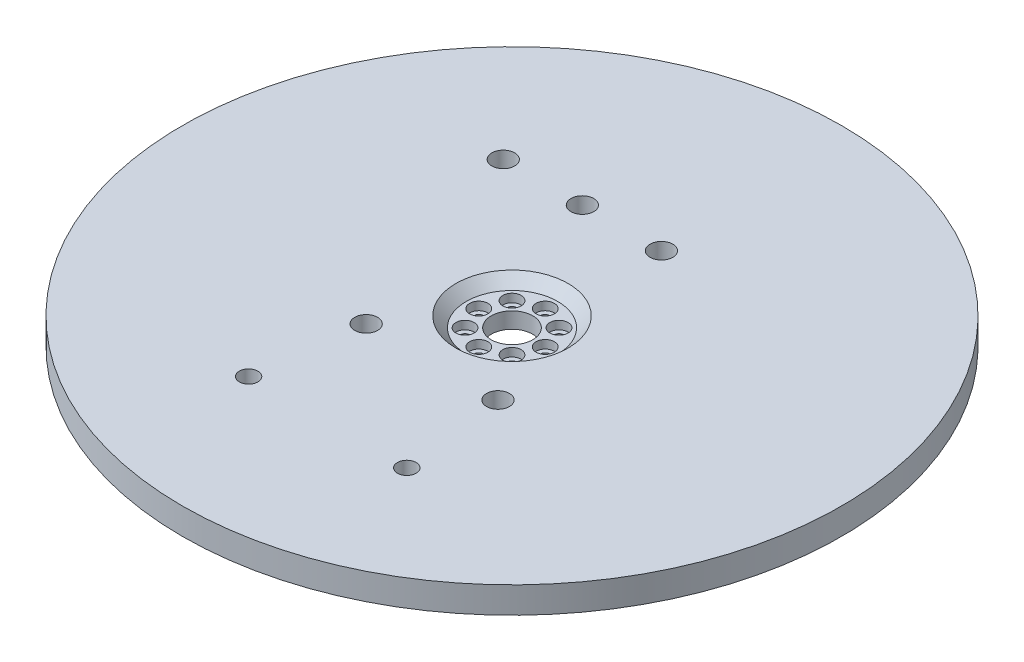
ISO-10303-21;
HEADER;
FILE_DESCRIPTION(('STEP AP214'),'2;1');
FILE_NAME('part.step','',(''),(''),'','','');
FILE_SCHEMA(('AUTOMOTIVE_DESIGN { 1 0 10303 214 1 1 1 1 }'));
ENDSEC;
DATA;
#1=APPLICATION_CONTEXT('core data for automotive mechanical design processes');
#2=APPLICATION_PROTOCOL_DEFINITION('international standard','automotive_design',2000,#1);
#3=PRODUCT_CONTEXT('',#1,'mechanical');
#4=PRODUCT('Part','Part','',(#3));
#5=PRODUCT_RELATED_PRODUCT_CATEGORY('part','',(#4));
#6=PRODUCT_DEFINITION_FORMATION('','',#4);
#7=PRODUCT_DEFINITION_CONTEXT('part definition',#1,'design');
#8=PRODUCT_DEFINITION('design','',#6,#7);
#9=PRODUCT_DEFINITION_SHAPE('','',#8);
#10=(LENGTH_UNIT() NAMED_UNIT(*) SI_UNIT(.MILLI.,.METRE.));
#11=(NAMED_UNIT(*) PLANE_ANGLE_UNIT() SI_UNIT($,.RADIAN.));
#12=(NAMED_UNIT(*) SI_UNIT($,.STERADIAN.) SOLID_ANGLE_UNIT());
#13=UNCERTAINTY_MEASURE_WITH_UNIT(LENGTH_MEASURE(1.E-05),#10,'distance_accuracy_value','');
#14=(GEOMETRIC_REPRESENTATION_CONTEXT(3) GLOBAL_UNCERTAINTY_ASSIGNED_CONTEXT((#13)) GLOBAL_UNIT_ASSIGNED_CONTEXT((#10,
#11,#12)) REPRESENTATION_CONTEXT('',''));
#15=CARTESIAN_POINT('',(0.,0.,0.));
#16=DIRECTION('',(0.,0.,1.));
#17=DIRECTION('',(1.,0.,0.));
#18=AXIS2_PLACEMENT_3D('',#15,#16,#17);
#19=CARTESIAN_POINT('',(0.,3.175,0.));
#20=DIRECTION('',(0.,-1.,0.));
#21=DIRECTION('',(0.,0.,-1.));
#22=AXIS2_PLACEMENT_3D('',#19,#20,#21);
#23=CYLINDRICAL_SURFACE('',#22,79.375);
#24=CARTESIAN_POINT('',(0.,3.175,0.));
#25=DIRECTION('',(0.,1.,0.));
#26=DIRECTION('',(0.,0.,1.));
#27=AXIS2_PLACEMENT_3D('',#24,#25,#26);
#28=CIRCLE('',#27,79.375);
#29=CARTESIAN_POINT('',(0.,3.175,79.375));
#30=VERTEX_POINT('',#29);
#31=EDGE_CURVE('E51',#30,#30,#28,.T.);
#32=ORIENTED_EDGE('',*,*,#31,.F.);
#33=EDGE_LOOP('',(#32));
#34=FACE_BOUND('',#33,.T.);
#35=CARTESIAN_POINT('',(0.,-3.175,0.));
#36=DIRECTION('',(0.,1.,0.));
#37=DIRECTION('',(0.,0.,1.));
#38=AXIS2_PLACEMENT_3D('',#35,#36,#37);
#39=CIRCLE('',#38,79.375);
#40=CARTESIAN_POINT('',(0.,-3.175,79.375));
#41=VERTEX_POINT('',#40);
#42=EDGE_CURVE('E55',#41,#41,#39,.T.);
#43=ORIENTED_EDGE('',*,*,#42,.T.);
#44=EDGE_LOOP('',(#43));
#45=FACE_BOUND('',#44,.T.);
#46=ADVANCED_FACE('F43',(#34,#45),#23,.T.);
#47=CARTESIAN_POINT('',(0.,3.175,0.));
#48=DIRECTION('',(0.,1.,0.));
#49=DIRECTION('',(0.,0.,1.));
#50=AXIS2_PLACEMENT_3D('',#47,#48,#49);
#51=PLANE('',#50);
#52=CARTESIAN_POINT('',(0.,3.175,0.));
#53=DIRECTION('',(0.,1.,0.));
#54=DIRECTION('',(0.,0.,1.));
#55=AXIS2_PLACEMENT_3D('',#52,#53,#54);
#56=CIRCLE('',#55,13.5000000000002);
#57=CARTESIAN_POINT('',(0.,3.175,13.5000000000002));
#58=VERTEX_POINT('',#57);
#59=EDGE_CURVE('E11',#58,#58,#56,.F.);
#60=ORIENTED_EDGE('',*,*,#59,.T.);
#61=EDGE_LOOP('',(#60));
#62=FACE_BOUND('',#61,.T.);
#63=CARTESIAN_POINT('',(-33.6688086,3.175,-31.5673879519193));
#64=DIRECTION('',(0.,1.,0.));
#65=DIRECTION('',(0.,0.,1.));
#66=AXIS2_PLACEMENT_3D('',#63,#64,#65);
#67=CIRCLE('',#66,2.75);
#68=CARTESIAN_POINT('',(-33.6688086,3.175,-28.8173879519193));
#69=VERTEX_POINT('',#68);
#70=EDGE_CURVE('E738',#69,#69,#67,.T.);
#71=ORIENTED_EDGE('',*,*,#70,.F.);
#72=EDGE_LOOP('',(#71));
#73=FACE_BOUND('',#72,.T.);
#74=CARTESIAN_POINT('',(-14.6188085999999,3.175,-31.5673879519193));
#75=DIRECTION('',(0.,1.,0.));
#76=DIRECTION('',(0.,0.,1.));
#77=AXIS2_PLACEMENT_3D('',#74,#75,#76);
#78=CIRCLE('',#77,2.75);
#79=CARTESIAN_POINT('',(-14.6188085999999,3.175,-28.8173879519193));
#80=VERTEX_POINT('',#79);
#81=EDGE_CURVE('E734',#80,#80,#78,.T.);
#82=ORIENTED_EDGE('',*,*,#81,.F.);
#83=EDGE_LOOP('',(#82));
#84=FACE_BOUND('',#83,.T.);
#85=CARTESIAN_POINT('',(4.43119140000003,3.175,-31.5673879519193));
#86=DIRECTION('',(0.,1.,0.));
#87=DIRECTION('',(0.,0.,1.));
#88=AXIS2_PLACEMENT_3D('',#85,#86,#87);
#89=CIRCLE('',#88,2.75);
#90=CARTESIAN_POINT('',(4.43119140000003,3.175,-28.8173879519193));
#91=VERTEX_POINT('',#90);
#92=EDGE_CURVE('E730',#91,#91,#89,.T.);
#93=ORIENTED_EDGE('',*,*,#92,.F.);
#94=EDGE_LOOP('',(#93));
#95=FACE_BOUND('',#94,.T.);
#96=CARTESIAN_POINT('',(-15.875,3.175,19.2497064480811));
#97=DIRECTION('',(0.,1.,0.));
#98=DIRECTION('',(0.,0.,1.));
#99=AXIS2_PLACEMENT_3D('',#96,#97,#98);
#100=CIRCLE('',#99,2.75);
#101=CARTESIAN_POINT('',(-15.875,3.175,21.9997064480811));
#102=VERTEX_POINT('',#101);
#103=EDGE_CURVE('E726',#102,#102,#100,.T.);
#104=ORIENTED_EDGE('',*,*,#103,.F.);
#105=EDGE_LOOP('',(#104));
#106=FACE_BOUND('',#105,.T.);
#107=CARTESIAN_POINT('',(15.875,3.175,19.2497064480811));
#108=DIRECTION('',(0.,1.,0.));
#109=DIRECTION('',(0.,0.,1.));
#110=AXIS2_PLACEMENT_3D('',#107,#108,#109);
#111=CIRCLE('',#110,2.75);
#112=CARTESIAN_POINT('',(15.875,3.175,21.9997064480811));
#113=VERTEX_POINT('',#112);
#114=EDGE_CURVE('E722',#113,#113,#111,.T.);
#115=ORIENTED_EDGE('',*,*,#114,.F.);
#116=EDGE_LOOP('',(#115));
#117=FACE_BOUND('',#116,.T.);
#118=CARTESIAN_POINT('',(19.0500000000001,3.175,44.3882120480811));
#119=DIRECTION('',(0.,1.,0.));
#120=DIRECTION('',(0.,0.,1.));
#121=AXIS2_PLACEMENT_3D('',#118,#119,#120);
#122=CIRCLE('',#121,2.25);
#123=CARTESIAN_POINT('',(19.0500000000001,3.175,46.6382120480811));
#124=VERTEX_POINT('',#123);
#125=EDGE_CURVE('E718',#124,#124,#122,.T.);
#126=ORIENTED_EDGE('',*,*,#125,.F.);
#127=EDGE_LOOP('',(#126));
#128=FACE_BOUND('',#127,.T.);
#129=CARTESIAN_POINT('',(-19.0499999999999,3.175,44.3882120480811));
#130=DIRECTION('',(0.,1.,0.));
#131=DIRECTION('',(0.,0.,1.));
#132=AXIS2_PLACEMENT_3D('',#129,#130,#131);
#133=CIRCLE('',#132,2.25);
#134=CARTESIAN_POINT('',(-19.0499999999999,3.175,46.6382120480811));
#135=VERTEX_POINT('',#134);
#136=EDGE_CURVE('E712',#135,#135,#133,.T.);
#137=ORIENTED_EDGE('',*,*,#136,.F.);
#138=EDGE_LOOP('',(#137));
#139=FACE_BOUND('',#138,.T.);
#140=ORIENTED_EDGE('',*,*,#31,.T.);
#141=EDGE_LOOP('',(#140));
#142=FACE_BOUND('',#141,.T.);
#143=ADVANCED_FACE('F188',(#62,#73,#84,#95,#106,#117,#128,#139,#142),#51,.T.);
#144=CARTESIAN_POINT('',(0.,-3.175,0.));
#145=DIRECTION('',(0.,1.,0.));
#146=DIRECTION('',(0.,0.,1.));
#147=AXIS2_PLACEMENT_3D('',#144,#145,#146);
#148=PLANE('',#147);
#149=CARTESIAN_POINT('',(-33.6688086,-3.175,-31.5673879519193));
#150=DIRECTION('',(0.,1.,0.));
#151=DIRECTION('',(0.,0.,1.));
#152=AXIS2_PLACEMENT_3D('',#149,#150,#151);
#153=CIRCLE('',#152,2.75);
#154=CARTESIAN_POINT('',(-33.6688086,-3.175,-28.8173879519193));
#155=VERTEX_POINT('',#154);
#156=EDGE_CURVE('E203',#155,#155,#153,.T.);
#157=ORIENTED_EDGE('',*,*,#156,.T.);
#158=EDGE_LOOP('',(#157));
#159=FACE_BOUND('',#158,.T.);
#160=CARTESIAN_POINT('',(-14.6188085999999,-3.175,-31.5673879519193));
#161=DIRECTION('',(0.,1.,0.));
#162=DIRECTION('',(0.,0.,1.));
#163=AXIS2_PLACEMENT_3D('',#160,#161,#162);
#164=CIRCLE('',#163,2.75);
#165=CARTESIAN_POINT('',(-14.6188085999999,-3.175,-28.8173879519193));
#166=VERTEX_POINT('',#165);
#167=EDGE_CURVE('E207',#166,#166,#164,.T.);
#168=ORIENTED_EDGE('',*,*,#167,.T.);
#169=EDGE_LOOP('',(#168));
#170=FACE_BOUND('',#169,.T.);
#171=CARTESIAN_POINT('',(4.43119140000003,-3.175,-31.5673879519193));
#172=DIRECTION('',(0.,1.,0.));
#173=DIRECTION('',(0.,0.,1.));
#174=AXIS2_PLACEMENT_3D('',#171,#172,#173);
#175=CIRCLE('',#174,2.75);
#176=CARTESIAN_POINT('',(4.43119140000003,-3.175,-28.8173879519193));
#177=VERTEX_POINT('',#176);
#178=EDGE_CURVE('E211',#177,#177,#175,.T.);
#179=ORIENTED_EDGE('',*,*,#178,.T.);
#180=EDGE_LOOP('',(#179));
#181=FACE_BOUND('',#180,.T.);
#182=CARTESIAN_POINT('',(-15.875,-3.175,19.2497064480811));
#183=DIRECTION('',(0.,1.,0.));
#184=DIRECTION('',(0.,0.,1.));
#185=AXIS2_PLACEMENT_3D('',#182,#183,#184);
#186=CIRCLE('',#185,2.75);
#187=CARTESIAN_POINT('',(-15.875,-3.175,21.9997064480811));
#188=VERTEX_POINT('',#187);
#189=EDGE_CURVE('E215',#188,#188,#186,.T.);
#190=ORIENTED_EDGE('',*,*,#189,.T.);
#191=EDGE_LOOP('',(#190));
#192=FACE_BOUND('',#191,.T.);
#193=CARTESIAN_POINT('',(15.875,-3.175,19.2497064480811));
#194=DIRECTION('',(0.,1.,0.));
#195=DIRECTION('',(0.,0.,1.));
#196=AXIS2_PLACEMENT_3D('',#193,#194,#195);
#197=CIRCLE('',#196,2.75);
#198=CARTESIAN_POINT('',(15.875,-3.175,21.9997064480811));
#199=VERTEX_POINT('',#198);
#200=EDGE_CURVE('E219',#199,#199,#197,.T.);
#201=ORIENTED_EDGE('',*,*,#200,.T.);
#202=EDGE_LOOP('',(#201));
#203=FACE_BOUND('',#202,.T.);
#204=CARTESIAN_POINT('',(19.0500000000001,-3.175,44.3882120480811));
#205=DIRECTION('',(0.,1.,0.));
#206=DIRECTION('',(0.,0.,1.));
#207=AXIS2_PLACEMENT_3D('',#204,#205,#206);
#208=CIRCLE('',#207,2.25);
#209=CARTESIAN_POINT('',(19.0500000000001,-3.175,46.6382120480811));
#210=VERTEX_POINT('',#209);
#211=EDGE_CURVE('E223',#210,#210,#208,.T.);
#212=ORIENTED_EDGE('',*,*,#211,.T.);
#213=EDGE_LOOP('',(#212));
#214=FACE_BOUND('',#213,.T.);
#215=CARTESIAN_POINT('',(-19.0499999999999,-3.175,44.3882120480811));
#216=DIRECTION('',(0.,1.,0.));
#217=DIRECTION('',(0.,0.,1.));
#218=AXIS2_PLACEMENT_3D('',#215,#216,#217);
#219=CIRCLE('',#218,2.25);
#220=CARTESIAN_POINT('',(-19.0499999999999,-3.175,46.6382120480811));
#221=VERTEX_POINT('',#220);
#222=EDGE_CURVE('E226',#221,#221,#219,.T.);
#223=ORIENTED_EDGE('',*,*,#222,.T.);
#224=EDGE_LOOP('',(#223));
#225=FACE_BOUND('',#224,.T.);
#226=CARTESIAN_POINT('',(-5.6568542495,-3.175,-5.6568542495));
#227=DIRECTION('',(0.,1.,0.));
#228=DIRECTION('',(0.,0.,1.));
#229=AXIS2_PLACEMENT_3D('',#226,#227,#228);
#230=CIRCLE('',#229,1.1);
#231=CARTESIAN_POINT('',(-5.6568542495,-3.175,-4.5568542495));
#232=VERTEX_POINT('',#231);
#233=EDGE_CURVE('E102',#232,#232,#230,.T.);
#234=ORIENTED_EDGE('',*,*,#233,.T.);
#235=EDGE_LOOP('',(#234));
#236=FACE_BOUND('',#235,.T.);
#237=CARTESIAN_POINT('',(0.,-3.175,-8.));
#238=DIRECTION('',(0.,1.,0.));
#239=DIRECTION('',(0.,0.,1.));
#240=AXIS2_PLACEMENT_3D('',#237,#238,#239);
#241=CIRCLE('',#240,1.1);
#242=CARTESIAN_POINT('',(0.,-3.175,-6.9));
#243=VERTEX_POINT('',#242);
#244=EDGE_CURVE('E98',#243,#243,#241,.T.);
#245=ORIENTED_EDGE('',*,*,#244,.T.);
#246=EDGE_LOOP('',(#245));
#247=FACE_BOUND('',#246,.T.);
#248=CARTESIAN_POINT('',(5.6568542495,-3.175,-5.6568542495));
#249=DIRECTION('',(0.,1.,0.));
#250=DIRECTION('',(0.,0.,1.));
#251=AXIS2_PLACEMENT_3D('',#248,#249,#250);
#252=CIRCLE('',#251,1.1);
#253=CARTESIAN_POINT('',(5.6568542495,-3.175,-4.5568542495));
#254=VERTEX_POINT('',#253);
#255=EDGE_CURVE('E93',#254,#254,#252,.T.);
#256=ORIENTED_EDGE('',*,*,#255,.T.);
#257=EDGE_LOOP('',(#256));
#258=FACE_BOUND('',#257,.T.);
#259=CARTESIAN_POINT('',(8.,-3.175,0.));
#260=DIRECTION('',(0.,1.,0.));
#261=DIRECTION('',(0.,0.,1.));
#262=AXIS2_PLACEMENT_3D('',#259,#260,#261);
#263=CIRCLE('',#262,1.1);
#264=CARTESIAN_POINT('',(8.,-3.175,1.1));
#265=VERTEX_POINT('',#264);
#266=EDGE_CURVE('E88',#265,#265,#263,.T.);
#267=ORIENTED_EDGE('',*,*,#266,.T.);
#268=EDGE_LOOP('',(#267));
#269=FACE_BOUND('',#268,.T.);
#270=CARTESIAN_POINT('',(5.6568542495,-3.175,5.6568542495));
#271=DIRECTION('',(0.,1.,0.));
#272=DIRECTION('',(0.,0.,1.));
#273=AXIS2_PLACEMENT_3D('',#270,#271,#272);
#274=CIRCLE('',#273,1.1);
#275=CARTESIAN_POINT('',(5.6568542495,-3.175,6.7568542495));
#276=VERTEX_POINT('',#275);
#277=EDGE_CURVE('E83',#276,#276,#274,.T.);
#278=ORIENTED_EDGE('',*,*,#277,.T.);
#279=EDGE_LOOP('',(#278));
#280=FACE_BOUND('',#279,.T.);
#281=CARTESIAN_POINT('',(0.,-3.175,8.));
#282=DIRECTION('',(0.,1.,0.));
#283=DIRECTION('',(0.,0.,1.));
#284=AXIS2_PLACEMENT_3D('',#281,#282,#283);
#285=CIRCLE('',#284,1.1);
#286=CARTESIAN_POINT('',(0.,-3.175,9.1));
#287=VERTEX_POINT('',#286);
#288=EDGE_CURVE('E78',#287,#287,#285,.T.);
#289=ORIENTED_EDGE('',*,*,#288,.T.);
#290=EDGE_LOOP('',(#289));
#291=FACE_BOUND('',#290,.T.);
#292=CARTESIAN_POINT('',(-5.6568542495,-3.175,5.6568542495));
#293=DIRECTION('',(0.,1.,0.));
#294=DIRECTION('',(0.,0.,1.));
#295=AXIS2_PLACEMENT_3D('',#292,#293,#294);
#296=CIRCLE('',#295,1.1);
#297=CARTESIAN_POINT('',(-5.6568542495,-3.175,6.7568542495));
#298=VERTEX_POINT('',#297);
#299=EDGE_CURVE('E73',#298,#298,#296,.T.);
#300=ORIENTED_EDGE('',*,*,#299,.T.);
#301=EDGE_LOOP('',(#300));
#302=FACE_BOUND('',#301,.T.);
#303=CARTESIAN_POINT('',(-8.,-3.175,0.));
#304=DIRECTION('',(0.,1.,0.));
#305=DIRECTION('',(0.,0.,1.));
#306=AXIS2_PLACEMENT_3D('',#303,#304,#305);
#307=CIRCLE('',#306,1.1);
#308=CARTESIAN_POINT('',(-8.,-3.175,1.1));
#309=VERTEX_POINT('',#308);
#310=EDGE_CURVE('E69',#309,#309,#307,.T.);
#311=ORIENTED_EDGE('',*,*,#310,.T.);
#312=EDGE_LOOP('',(#311));
#313=FACE_BOUND('',#312,.T.);
#314=CARTESIAN_POINT('',(0.,-3.175,0.));
#315=DIRECTION('',(0.,1.,0.));
#316=DIRECTION('',(0.,0.,1.));
#317=AXIS2_PLACEMENT_3D('',#314,#315,#316);
#318=CIRCLE('',#317,5.);
#319=CARTESIAN_POINT('',(0.,-3.175,5.));
#320=VERTEX_POINT('',#319);
#321=EDGE_CURVE('E68',#320,#320,#318,.T.);
#322=ORIENTED_EDGE('',*,*,#321,.T.);
#323=EDGE_LOOP('',(#322));
#324=FACE_BOUND('',#323,.T.);
#325=ORIENTED_EDGE('',*,*,#42,.F.);
#326=EDGE_LOOP('',(#325));
#327=FACE_BOUND('',#326,.T.);
#328=ADVANCED_FACE('F169',(#159,#170,#181,#192,#203,#214,#225,#236,#247,#258,#269,#280,#291,
#302,#313,#324,#327),#148,.F.);
#329=CARTESIAN_POINT('',(0.,0.675,0.));
#330=DIRECTION('',(0.,1.,0.));
#331=DIRECTION('',(0.,0.,1.));
#332=AXIS2_PLACEMENT_3D('',#329,#330,#331);
#333=PLANE('',#332);
#334=CARTESIAN_POINT('',(-5.6568542495,0.675,-5.6568542495));
#335=DIRECTION('',(0.,1.,0.));
#336=DIRECTION('',(0.,0.,1.));
#337=AXIS2_PLACEMENT_3D('',#334,#335,#336);
#338=CIRCLE('',#337,2.19999999999999);
#339=CARTESIAN_POINT('',(-5.6568542495,0.675,-3.45685424950001));
#340=VERTEX_POINT('',#339);
#341=EDGE_CURVE('E117',#340,#340,#338,.T.);
#342=ORIENTED_EDGE('',*,*,#341,.F.);
#343=EDGE_LOOP('',(#342));
#344=FACE_BOUND('',#343,.T.);
#345=CARTESIAN_POINT('',(0.,0.675,-8.));
#346=DIRECTION('',(0.,1.,0.));
#347=DIRECTION('',(0.,0.,1.));
#348=AXIS2_PLACEMENT_3D('',#345,#346,#347);
#349=CIRCLE('',#348,2.19999999999999);
#350=CARTESIAN_POINT('',(0.,0.675,-5.80000000000001));
#351=VERTEX_POINT('',#350);
#352=EDGE_CURVE('E104',#351,#351,#349,.T.);
#353=ORIENTED_EDGE('',*,*,#352,.F.);
#354=EDGE_LOOP('',(#353));
#355=FACE_BOUND('',#354,.T.);
#356=CARTESIAN_POINT('',(5.6568542495,0.675,-5.6568542495));
#357=DIRECTION('',(0.,1.,0.));
#358=DIRECTION('',(0.,0.,1.));
#359=AXIS2_PLACEMENT_3D('',#356,#357,#358);
#360=CIRCLE('',#359,2.19999999999999);
#361=CARTESIAN_POINT('',(5.6568542495,0.675,-3.45685424950001));
#362=VERTEX_POINT('',#361);
#363=EDGE_CURVE('E100',#362,#362,#360,.T.);
#364=ORIENTED_EDGE('',*,*,#363,.F.);
#365=EDGE_LOOP('',(#364));
#366=FACE_BOUND('',#365,.T.);
#367=CARTESIAN_POINT('',(8.,0.675,0.));
#368=DIRECTION('',(0.,1.,0.));
#369=DIRECTION('',(0.,0.,1.));
#370=AXIS2_PLACEMENT_3D('',#367,#368,#369);
#371=CIRCLE('',#370,2.19999999999999);
#372=CARTESIAN_POINT('',(8.,0.675,2.19999999999999));
#373=VERTEX_POINT('',#372);
#374=EDGE_CURVE('E96',#373,#373,#371,.T.);
#375=ORIENTED_EDGE('',*,*,#374,.F.);
#376=EDGE_LOOP('',(#375));
#377=FACE_BOUND('',#376,.T.);
#378=CARTESIAN_POINT('',(5.6568542495,0.675,5.6568542495));
#379=DIRECTION('',(0.,1.,0.));
#380=DIRECTION('',(0.,0.,1.));
#381=AXIS2_PLACEMENT_3D('',#378,#379,#380);
#382=CIRCLE('',#381,2.19999999999999);
#383=CARTESIAN_POINT('',(5.6568542495,0.675,7.85685424949999));
#384=VERTEX_POINT('',#383);
#385=EDGE_CURVE('E91',#384,#384,#382,.T.);
#386=ORIENTED_EDGE('',*,*,#385,.F.);
#387=EDGE_LOOP('',(#386));
#388=FACE_BOUND('',#387,.T.);
#389=CARTESIAN_POINT('',(0.,0.675,8.));
#390=DIRECTION('',(0.,1.,0.));
#391=DIRECTION('',(0.,0.,1.));
#392=AXIS2_PLACEMENT_3D('',#389,#390,#391);
#393=CIRCLE('',#392,2.19999999999999);
#394=CARTESIAN_POINT('',(0.,0.675,10.2));
#395=VERTEX_POINT('',#394);
#396=EDGE_CURVE('E86',#395,#395,#393,.T.);
#397=ORIENTED_EDGE('',*,*,#396,.F.);
#398=EDGE_LOOP('',(#397));
#399=FACE_BOUND('',#398,.T.);
#400=CARTESIAN_POINT('',(-5.6568542495,0.675,5.6568542495));
#401=DIRECTION('',(0.,1.,0.));
#402=DIRECTION('',(0.,0.,1.));
#403=AXIS2_PLACEMENT_3D('',#400,#401,#402);
#404=CIRCLE('',#403,2.19999999999999);
#405=CARTESIAN_POINT('',(-5.6568542495,0.675,7.85685424949999));
#406=VERTEX_POINT('',#405);
#407=EDGE_CURVE('E81',#406,#406,#404,.T.);
#408=ORIENTED_EDGE('',*,*,#407,.F.);
#409=EDGE_LOOP('',(#408));
#410=FACE_BOUND('',#409,.T.);
#411=CARTESIAN_POINT('',(-8.,0.675,0.));
#412=DIRECTION('',(0.,1.,0.));
#413=DIRECTION('',(0.,0.,1.));
#414=AXIS2_PLACEMENT_3D('',#411,#412,#413);
#415=CIRCLE('',#414,2.19999999999999);
#416=CARTESIAN_POINT('',(-8.,0.675,2.19999999999999));
#417=VERTEX_POINT('',#416);
#418=EDGE_CURVE('E76',#417,#417,#415,.T.);
#419=ORIENTED_EDGE('',*,*,#418,.F.);
#420=EDGE_LOOP('',(#419));
#421=FACE_BOUND('',#420,.T.);
#422=CARTESIAN_POINT('',(0.,0.675,0.));
#423=DIRECTION('',(0.,1.,0.));
#424=DIRECTION('',(0.,0.,1.));
#425=AXIS2_PLACEMENT_3D('',#422,#423,#424);
#426=CIRCLE('',#425,5.);
#427=CARTESIAN_POINT('',(0.,0.675,5.));
#428=VERTEX_POINT('',#427);
#429=EDGE_CURVE('E65',#428,#428,#426,.T.);
#430=ORIENTED_EDGE('',*,*,#429,.F.);
#431=EDGE_LOOP('',(#430));
#432=FACE_BOUND('',#431,.T.);
#433=CARTESIAN_POINT('',(0.,0.675000000000002,0.));
#434=DIRECTION('',(0.,1.,0.));
#435=DIRECTION('',(0.,0.,1.));
#436=AXIS2_PLACEMENT_3D('',#433,#434,#435);
#437=CIRCLE('',#436,11.);
#438=CARTESIAN_POINT('',(0.,0.675000000000002,11.));
#439=VERTEX_POINT('',#438);
#440=EDGE_CURVE('E60',#439,#439,#437,.F.);
#441=ORIENTED_EDGE('',*,*,#440,.F.);
#442=EDGE_LOOP('',(#441));
#443=FACE_BOUND('',#442,.T.);
#444=ADVANCED_FACE('F175',(#344,#355,#366,#377,#388,#399,#410,#421,#432,#443),#333,.T.);
#445=CARTESIAN_POINT('',(0.,-3.175,0.));
#446=DIRECTION('',(0.,1.,0.));
#447=DIRECTION('',(0.,0.,1.));
#448=AXIS2_PLACEMENT_3D('',#445,#446,#447);
#449=CYLINDRICAL_SURFACE('',#448,5.);
#450=ORIENTED_EDGE('',*,*,#429,.T.);
#451=EDGE_LOOP('',(#450));
#452=FACE_BOUND('',#451,.T.);
#453=ORIENTED_EDGE('',*,*,#321,.F.);
#454=EDGE_LOOP('',(#453));
#455=FACE_BOUND('',#454,.T.);
#456=ADVANCED_FACE('F172',(#452,#455),#449,.F.);
#457=CARTESIAN_POINT('',(-8.,0.675,0.));
#458=DIRECTION('',(0.,1.,0.));
#459=DIRECTION('',(0.,0.,1.));
#460=AXIS2_PLACEMENT_3D('',#457,#458,#459);
#461=CYLINDRICAL_SURFACE('',#460,1.1);
#462=CARTESIAN_POINT('',(-8.,-1.325,0.));
#463=DIRECTION('',(0.,1.,0.));
#464=DIRECTION('',(0.,0.,1.));
#465=AXIS2_PLACEMENT_3D('',#462,#463,#464);
#466=CIRCLE('',#465,1.1);
#467=CARTESIAN_POINT('',(-8.,-1.325,1.1));
#468=VERTEX_POINT('',#467);
#469=EDGE_CURVE('E72',#468,#468,#466,.T.);
#470=ORIENTED_EDGE('',*,*,#469,.T.);
#471=EDGE_LOOP('',(#470));
#472=FACE_BOUND('',#471,.T.);
#473=ORIENTED_EDGE('',*,*,#310,.F.);
#474=EDGE_LOOP('',(#473));
#475=FACE_BOUND('',#474,.T.);
#476=ADVANCED_FACE('F174',(#472,#475),#461,.F.);
#477=CARTESIAN_POINT('',(-6.9,-1.325,0.));
#478=DIRECTION('',(0.,-1.,0.));
#479=DIRECTION('',(0.,0.,-1.));
#480=AXIS2_PLACEMENT_3D('',#477,#478,#479);
#481=PLANE('',#480);
#482=ORIENTED_EDGE('',*,*,#469,.F.);
#483=EDGE_LOOP('',(#482));
#484=FACE_BOUND('',#483,.T.);
#485=CARTESIAN_POINT('',(-8.,-1.325,0.));
#486=DIRECTION('',(0.,1.,0.));
#487=DIRECTION('',(0.,0.,1.));
#488=AXIS2_PLACEMENT_3D('',#485,#486,#487);
#489=CIRCLE('',#488,2.2);
#490=CARTESIAN_POINT('',(-8.,-1.325,2.2));
#491=VERTEX_POINT('',#490);
#492=EDGE_CURVE('E162',#491,#491,#489,.T.);
#493=ORIENTED_EDGE('',*,*,#492,.T.);
#494=EDGE_LOOP('',(#493));
#495=FACE_BOUND('',#494,.T.);
#496=ADVANCED_FACE('F182',(#484,#495),#481,.F.);
#497=CARTESIAN_POINT('',(-8.,0.675,0.));
#498=DIRECTION('',(0.,1.,0.));
#499=DIRECTION('',(0.,0.,1.));
#500=AXIS2_PLACEMENT_3D('',#497,#498,#499);
#501=CYLINDRICAL_SURFACE('',#500,2.19999999999999);
#502=ORIENTED_EDGE('',*,*,#492,.F.);
#503=EDGE_LOOP('',(#502));
#504=FACE_BOUND('',#503,.T.);
#505=ORIENTED_EDGE('',*,*,#418,.T.);
#506=EDGE_LOOP('',(#505));
#507=FACE_BOUND('',#506,.T.);
#508=ADVANCED_FACE('F246',(#504,#507),#501,.F.);
#509=CARTESIAN_POINT('',(-5.6568542495,0.675,5.6568542495));
#510=DIRECTION('',(0.,1.,0.));
#511=DIRECTION('',(0.,0.,1.));
#512=AXIS2_PLACEMENT_3D('',#509,#510,#511);
#513=CYLINDRICAL_SURFACE('',#512,1.1);
#514=CARTESIAN_POINT('',(-5.6568542495,-1.325,5.6568542495));
#515=DIRECTION('',(0.,1.,0.));
#516=DIRECTION('',(0.,0.,1.));
#517=AXIS2_PLACEMENT_3D('',#514,#515,#516);
#518=CIRCLE('',#517,1.1);
#519=CARTESIAN_POINT('',(-5.6568542495,-1.325,6.7568542495));
#520=VERTEX_POINT('',#519);
#521=EDGE_CURVE('E77',#520,#520,#518,.T.);
#522=ORIENTED_EDGE('',*,*,#521,.T.);
#523=EDGE_LOOP('',(#522));
#524=FACE_BOUND('',#523,.T.);
#525=ORIENTED_EDGE('',*,*,#299,.F.);
#526=EDGE_LOOP('',(#525));
#527=FACE_BOUND('',#526,.T.);
#528=ADVANCED_FACE('F243',(#524,#527),#513,.F.);
#529=CARTESIAN_POINT('',(-4.5568542495,-1.325,5.6568542495));
#530=DIRECTION('',(0.,-1.,0.));
#531=DIRECTION('',(0.,0.,-1.));
#532=AXIS2_PLACEMENT_3D('',#529,#530,#531);
#533=PLANE('',#532);
#534=ORIENTED_EDGE('',*,*,#521,.F.);
#535=EDGE_LOOP('',(#534));
#536=FACE_BOUND('',#535,.T.);
#537=CARTESIAN_POINT('',(-5.6568542495,-1.325,5.6568542495));
#538=DIRECTION('',(0.,1.,0.));
#539=DIRECTION('',(0.,0.,1.));
#540=AXIS2_PLACEMENT_3D('',#537,#538,#539);
#541=CIRCLE('',#540,2.2);
#542=CARTESIAN_POINT('',(-5.6568542495,-1.325,7.8568542495));
#543=VERTEX_POINT('',#542);
#544=EDGE_CURVE('E155',#543,#543,#541,.T.);
#545=ORIENTED_EDGE('',*,*,#544,.T.);
#546=EDGE_LOOP('',(#545));
#547=FACE_BOUND('',#546,.T.);
#548=ADVANCED_FACE('F245',(#536,#547),#533,.F.);
#549=CARTESIAN_POINT('',(-5.6568542495,0.675,5.6568542495));
#550=DIRECTION('',(0.,1.,0.));
#551=DIRECTION('',(0.,0.,1.));
#552=AXIS2_PLACEMENT_3D('',#549,#550,#551);
#553=CYLINDRICAL_SURFACE('',#552,2.19999999999999);
#554=ORIENTED_EDGE('',*,*,#544,.F.);
#555=EDGE_LOOP('',(#554));
#556=FACE_BOUND('',#555,.T.);
#557=ORIENTED_EDGE('',*,*,#407,.T.);
#558=EDGE_LOOP('',(#557));
#559=FACE_BOUND('',#558,.T.);
#560=ADVANCED_FACE('F253',(#556,#559),#553,.F.);
#561=CARTESIAN_POINT('',(0.,0.675,8.));
#562=DIRECTION('',(0.,1.,0.));
#563=DIRECTION('',(0.,0.,1.));
#564=AXIS2_PLACEMENT_3D('',#561,#562,#563);
#565=CYLINDRICAL_SURFACE('',#564,1.1);
#566=CARTESIAN_POINT('',(0.,-1.325,8.));
#567=DIRECTION('',(0.,1.,0.));
#568=DIRECTION('',(0.,0.,1.));
#569=AXIS2_PLACEMENT_3D('',#566,#567,#568);
#570=CIRCLE('',#569,1.1);
#571=CARTESIAN_POINT('',(0.,-1.325,9.1));
#572=VERTEX_POINT('',#571);
#573=EDGE_CURVE('E82',#572,#572,#570,.T.);
#574=ORIENTED_EDGE('',*,*,#573,.T.);
#575=EDGE_LOOP('',(#574));
#576=FACE_BOUND('',#575,.T.);
#577=ORIENTED_EDGE('',*,*,#288,.F.);
#578=EDGE_LOOP('',(#577));
#579=FACE_BOUND('',#578,.T.);
#580=ADVANCED_FACE('F378',(#576,#579),#565,.F.);
#581=CARTESIAN_POINT('',(1.1,-1.325,8.));
#582=DIRECTION('',(0.,-1.,0.));
#583=DIRECTION('',(0.,0.,-1.));
#584=AXIS2_PLACEMENT_3D('',#581,#582,#583);
#585=PLANE('',#584);
#586=ORIENTED_EDGE('',*,*,#573,.F.);
#587=EDGE_LOOP('',(#586));
#588=FACE_BOUND('',#587,.T.);
#589=CARTESIAN_POINT('',(0.,-1.325,8.));
#590=DIRECTION('',(0.,1.,0.));
#591=DIRECTION('',(0.,0.,1.));
#592=AXIS2_PLACEMENT_3D('',#589,#590,#591);
#593=CIRCLE('',#592,2.2);
#594=CARTESIAN_POINT('',(0.,-1.325,10.2));
#595=VERTEX_POINT('',#594);
#596=EDGE_CURVE('E148',#595,#595,#593,.T.);
#597=ORIENTED_EDGE('',*,*,#596,.T.);
#598=EDGE_LOOP('',(#597));
#599=FACE_BOUND('',#598,.T.);
#600=ADVANCED_FACE('F374',(#588,#599),#585,.F.);
#601=CARTESIAN_POINT('',(0.,0.675,8.));
#602=DIRECTION('',(0.,1.,0.));
#603=DIRECTION('',(0.,0.,1.));
#604=AXIS2_PLACEMENT_3D('',#601,#602,#603);
#605=CYLINDRICAL_SURFACE('',#604,2.19999999999999);
#606=ORIENTED_EDGE('',*,*,#596,.F.);
#607=EDGE_LOOP('',(#606));
#608=FACE_BOUND('',#607,.T.);
#609=ORIENTED_EDGE('',*,*,#396,.T.);
#610=EDGE_LOOP('',(#609));
#611=FACE_BOUND('',#610,.T.);
#612=ADVANCED_FACE('F370',(#608,#611),#605,.F.);
#613=CARTESIAN_POINT('',(5.6568542495,0.675,5.6568542495));
#614=DIRECTION('',(0.,1.,0.));
#615=DIRECTION('',(0.,0.,1.));
#616=AXIS2_PLACEMENT_3D('',#613,#614,#615);
#617=CYLINDRICAL_SURFACE('',#616,1.1);
#618=CARTESIAN_POINT('',(5.6568542495,-1.325,5.6568542495));
#619=DIRECTION('',(0.,1.,0.));
#620=DIRECTION('',(0.,0.,1.));
#621=AXIS2_PLACEMENT_3D('',#618,#619,#620);
#622=CIRCLE('',#621,1.1);
#623=CARTESIAN_POINT('',(5.6568542495,-1.325,6.7568542495));
#624=VERTEX_POINT('',#623);
#625=EDGE_CURVE('E87',#624,#624,#622,.T.);
#626=ORIENTED_EDGE('',*,*,#625,.T.);
#627=EDGE_LOOP('',(#626));
#628=FACE_BOUND('',#627,.T.);
#629=ORIENTED_EDGE('',*,*,#277,.F.);
#630=EDGE_LOOP('',(#629));
#631=FACE_BOUND('',#630,.T.);
#632=ADVANCED_FACE('F366',(#628,#631),#617,.F.);
#633=CARTESIAN_POINT('',(6.7568542495,-1.325,5.6568542495));
#634=DIRECTION('',(0.,-1.,0.));
#635=DIRECTION('',(0.,0.,-1.));
#636=AXIS2_PLACEMENT_3D('',#633,#634,#635);
#637=PLANE('',#636);
#638=ORIENTED_EDGE('',*,*,#625,.F.);
#639=EDGE_LOOP('',(#638));
#640=FACE_BOUND('',#639,.T.);
#641=CARTESIAN_POINT('',(5.6568542495,-1.325,5.6568542495));
#642=DIRECTION('',(0.,1.,0.));
#643=DIRECTION('',(0.,0.,1.));
#644=AXIS2_PLACEMENT_3D('',#641,#642,#643);
#645=CIRCLE('',#644,2.2);
#646=CARTESIAN_POINT('',(5.6568542495,-1.325,7.8568542495));
#647=VERTEX_POINT('',#646);
#648=EDGE_CURVE('E141',#647,#647,#645,.T.);
#649=ORIENTED_EDGE('',*,*,#648,.T.);
#650=EDGE_LOOP('',(#649));
#651=FACE_BOUND('',#650,.T.);
#652=ADVANCED_FACE('F362',(#640,#651),#637,.F.);
#653=CARTESIAN_POINT('',(5.6568542495,0.675,5.6568542495));
#654=DIRECTION('',(0.,1.,0.));
#655=DIRECTION('',(0.,0.,1.));
#656=AXIS2_PLACEMENT_3D('',#653,#654,#655);
#657=CYLINDRICAL_SURFACE('',#656,2.19999999999999);
#658=ORIENTED_EDGE('',*,*,#648,.F.);
#659=EDGE_LOOP('',(#658));
#660=FACE_BOUND('',#659,.T.);
#661=ORIENTED_EDGE('',*,*,#385,.T.);
#662=EDGE_LOOP('',(#661));
#663=FACE_BOUND('',#662,.T.);
#664=ADVANCED_FACE('F358',(#660,#663),#657,.F.);
#665=CARTESIAN_POINT('',(8.,0.675,0.));
#666=DIRECTION('',(0.,1.,0.));
#667=DIRECTION('',(0.,0.,1.));
#668=AXIS2_PLACEMENT_3D('',#665,#666,#667);
#669=CYLINDRICAL_SURFACE('',#668,1.1);
#670=CARTESIAN_POINT('',(8.,-1.325,0.));
#671=DIRECTION('',(0.,1.,0.));
#672=DIRECTION('',(0.,0.,1.));
#673=AXIS2_PLACEMENT_3D('',#670,#671,#672);
#674=CIRCLE('',#673,1.1);
#675=CARTESIAN_POINT('',(8.,-1.325,1.1));
#676=VERTEX_POINT('',#675);
#677=EDGE_CURVE('E92',#676,#676,#674,.T.);
#678=ORIENTED_EDGE('',*,*,#677,.T.);
#679=EDGE_LOOP('',(#678));
#680=FACE_BOUND('',#679,.T.);
#681=ORIENTED_EDGE('',*,*,#266,.F.);
#682=EDGE_LOOP('',(#681));
#683=FACE_BOUND('',#682,.T.);
#684=ADVANCED_FACE('F354',(#680,#683),#669,.F.);
#685=CARTESIAN_POINT('',(9.1,-1.325,0.));
#686=DIRECTION('',(0.,-1.,0.));
#687=DIRECTION('',(0.,0.,-1.));
#688=AXIS2_PLACEMENT_3D('',#685,#686,#687);
#689=PLANE('',#688);
#690=ORIENTED_EDGE('',*,*,#677,.F.);
#691=EDGE_LOOP('',(#690));
#692=FACE_BOUND('',#691,.T.);
#693=CARTESIAN_POINT('',(8.,-1.325,0.));
#694=DIRECTION('',(0.,1.,0.));
#695=DIRECTION('',(0.,0.,1.));
#696=AXIS2_PLACEMENT_3D('',#693,#694,#695);
#697=CIRCLE('',#696,2.2);
#698=CARTESIAN_POINT('',(8.,-1.325,2.2));
#699=VERTEX_POINT('',#698);
#700=EDGE_CURVE('E134',#699,#699,#697,.T.);
#701=ORIENTED_EDGE('',*,*,#700,.T.);
#702=EDGE_LOOP('',(#701));
#703=FACE_BOUND('',#702,.T.);
#704=ADVANCED_FACE('F350',(#692,#703),#689,.F.);
#705=CARTESIAN_POINT('',(8.,0.675,0.));
#706=DIRECTION('',(0.,1.,0.));
#707=DIRECTION('',(0.,0.,1.));
#708=AXIS2_PLACEMENT_3D('',#705,#706,#707);
#709=CYLINDRICAL_SURFACE('',#708,2.2);
#710=ORIENTED_EDGE('',*,*,#700,.F.);
#711=EDGE_LOOP('',(#710));
#712=FACE_BOUND('',#711,.T.);
#713=ORIENTED_EDGE('',*,*,#374,.T.);
#714=EDGE_LOOP('',(#713));
#715=FACE_BOUND('',#714,.T.);
#716=ADVANCED_FACE('F346',(#712,#715),#709,.F.);
#717=CARTESIAN_POINT('',(5.6568542495,0.675,-5.6568542495));
#718=DIRECTION('',(0.,1.,0.));
#719=DIRECTION('',(0.,0.,1.));
#720=AXIS2_PLACEMENT_3D('',#717,#718,#719);
#721=CYLINDRICAL_SURFACE('',#720,1.1);
#722=CARTESIAN_POINT('',(5.6568542495,-1.325,-5.6568542495));
#723=DIRECTION('',(0.,1.,0.));
#724=DIRECTION('',(0.,0.,1.));
#725=AXIS2_PLACEMENT_3D('',#722,#723,#724);
#726=CIRCLE('',#725,1.1);
#727=CARTESIAN_POINT('',(5.6568542495,-1.325,-4.5568542495));
#728=VERTEX_POINT('',#727);
#729=EDGE_CURVE('E97',#728,#728,#726,.T.);
#730=ORIENTED_EDGE('',*,*,#729,.T.);
#731=EDGE_LOOP('',(#730));
#732=FACE_BOUND('',#731,.T.);
#733=ORIENTED_EDGE('',*,*,#255,.F.);
#734=EDGE_LOOP('',(#733));
#735=FACE_BOUND('',#734,.T.);
#736=ADVANCED_FACE('F342',(#732,#735),#721,.F.);
#737=CARTESIAN_POINT('',(6.7568542495,-1.325,-5.6568542495));
#738=DIRECTION('',(0.,-1.,0.));
#739=DIRECTION('',(0.,0.,-1.));
#740=AXIS2_PLACEMENT_3D('',#737,#738,#739);
#741=PLANE('',#740);
#742=ORIENTED_EDGE('',*,*,#729,.F.);
#743=EDGE_LOOP('',(#742));
#744=FACE_BOUND('',#743,.T.);
#745=CARTESIAN_POINT('',(5.6568542495,-1.325,-5.6568542495));
#746=DIRECTION('',(0.,1.,0.));
#747=DIRECTION('',(0.,0.,1.));
#748=AXIS2_PLACEMENT_3D('',#745,#746,#747);
#749=CIRCLE('',#748,2.2);
#750=CARTESIAN_POINT('',(5.6568542495,-1.325,-3.4568542495));
#751=VERTEX_POINT('',#750);
#752=EDGE_CURVE('E127',#751,#751,#749,.T.);
#753=ORIENTED_EDGE('',*,*,#752,.T.);
#754=EDGE_LOOP('',(#753));
#755=FACE_BOUND('',#754,.T.);
#756=ADVANCED_FACE('F338',(#744,#755),#741,.F.);
#757=CARTESIAN_POINT('',(5.6568542495,0.675,-5.6568542495));
#758=DIRECTION('',(0.,1.,0.));
#759=DIRECTION('',(0.,0.,1.));
#760=AXIS2_PLACEMENT_3D('',#757,#758,#759);
#761=CYLINDRICAL_SURFACE('',#760,2.19999999999999);
#762=ORIENTED_EDGE('',*,*,#752,.F.);
#763=EDGE_LOOP('',(#762));
#764=FACE_BOUND('',#763,.T.);
#765=ORIENTED_EDGE('',*,*,#363,.T.);
#766=EDGE_LOOP('',(#765));
#767=FACE_BOUND('',#766,.T.);
#768=ADVANCED_FACE('F334',(#764,#767),#761,.F.);
#769=CARTESIAN_POINT('',(0.,0.675,-8.));
#770=DIRECTION('',(0.,1.,0.));
#771=DIRECTION('',(0.,0.,1.));
#772=AXIS2_PLACEMENT_3D('',#769,#770,#771);
#773=CYLINDRICAL_SURFACE('',#772,1.1);
#774=CARTESIAN_POINT('',(0.,-1.325,-8.));
#775=DIRECTION('',(0.,1.,0.));
#776=DIRECTION('',(0.,0.,1.));
#777=AXIS2_PLACEMENT_3D('',#774,#775,#776);
#778=CIRCLE('',#777,1.1);
#779=CARTESIAN_POINT('',(0.,-1.325,-6.9));
#780=VERTEX_POINT('',#779);
#781=EDGE_CURVE('E101',#780,#780,#778,.T.);
#782=ORIENTED_EDGE('',*,*,#781,.T.);
#783=EDGE_LOOP('',(#782));
#784=FACE_BOUND('',#783,.T.);
#785=ORIENTED_EDGE('',*,*,#244,.F.);
#786=EDGE_LOOP('',(#785));
#787=FACE_BOUND('',#786,.T.);
#788=ADVANCED_FACE('F330',(#784,#787),#773,.F.);
#789=CARTESIAN_POINT('',(1.1,-1.325,-8.));
#790=DIRECTION('',(0.,-1.,0.));
#791=DIRECTION('',(0.,0.,-1.));
#792=AXIS2_PLACEMENT_3D('',#789,#790,#791);
#793=PLANE('',#792);
#794=ORIENTED_EDGE('',*,*,#781,.F.);
#795=EDGE_LOOP('',(#794));
#796=FACE_BOUND('',#795,.T.);
#797=CARTESIAN_POINT('',(0.,-1.325,-8.));
#798=DIRECTION('',(0.,1.,0.));
#799=DIRECTION('',(0.,0.,1.));
#800=AXIS2_PLACEMENT_3D('',#797,#798,#799);
#801=CIRCLE('',#800,2.2);
#802=CARTESIAN_POINT('',(0.,-1.325,-5.8));
#803=VERTEX_POINT('',#802);
#804=EDGE_CURVE('E109',#803,#803,#801,.T.);
#805=ORIENTED_EDGE('',*,*,#804,.T.);
#806=EDGE_LOOP('',(#805));
#807=FACE_BOUND('',#806,.T.);
#808=ADVANCED_FACE('F326',(#796,#807),#793,.F.);
#809=CARTESIAN_POINT('',(0.,0.675,-8.));
#810=DIRECTION('',(0.,1.,0.));
#811=DIRECTION('',(0.,0.,1.));
#812=AXIS2_PLACEMENT_3D('',#809,#810,#811);
#813=CYLINDRICAL_SURFACE('',#812,2.19999999999999);
#814=ORIENTED_EDGE('',*,*,#804,.F.);
#815=EDGE_LOOP('',(#814));
#816=FACE_BOUND('',#815,.T.);
#817=ORIENTED_EDGE('',*,*,#352,.T.);
#818=EDGE_LOOP('',(#817));
#819=FACE_BOUND('',#818,.T.);
#820=ADVANCED_FACE('F323',(#816,#819),#813,.F.);
#821=CARTESIAN_POINT('',(-5.6568542495,0.675,-5.6568542495));
#822=DIRECTION('',(0.,1.,0.));
#823=DIRECTION('',(0.,0.,1.));
#824=AXIS2_PLACEMENT_3D('',#821,#822,#823);
#825=CYLINDRICAL_SURFACE('',#824,1.1);
#826=CARTESIAN_POINT('',(-5.6568542495,-1.325,-5.6568542495));
#827=DIRECTION('',(0.,1.,0.));
#828=DIRECTION('',(0.,0.,1.));
#829=AXIS2_PLACEMENT_3D('',#826,#827,#828);
#830=CIRCLE('',#829,1.1);
#831=CARTESIAN_POINT('',(-5.6568542495,-1.325,-4.5568542495));
#832=VERTEX_POINT('',#831);
#833=EDGE_CURVE('E105',#832,#832,#830,.T.);
#834=ORIENTED_EDGE('',*,*,#833,.T.);
#835=EDGE_LOOP('',(#834));
#836=FACE_BOUND('',#835,.T.);
#837=ORIENTED_EDGE('',*,*,#233,.F.);
#838=EDGE_LOOP('',(#837));
#839=FACE_BOUND('',#838,.T.);
#840=ADVANCED_FACE('F319',(#836,#839),#825,.F.);
#841=CARTESIAN_POINT('',(-4.5568542495,-1.325,-5.6568542495));
#842=DIRECTION('',(0.,-1.,0.));
#843=DIRECTION('',(0.,0.,-1.));
#844=AXIS2_PLACEMENT_3D('',#841,#842,#843);
#845=PLANE('',#844);
#846=ORIENTED_EDGE('',*,*,#833,.F.);
#847=EDGE_LOOP('',(#846));
#848=FACE_BOUND('',#847,.T.);
#849=CARTESIAN_POINT('',(-5.6568542495,-1.325,-5.6568542495));
#850=DIRECTION('',(0.,1.,0.));
#851=DIRECTION('',(0.,0.,1.));
#852=AXIS2_PLACEMENT_3D('',#849,#850,#851);
#853=CIRCLE('',#852,2.2);
#854=CARTESIAN_POINT('',(-5.6568542495,-1.325,-3.4568542495));
#855=VERTEX_POINT('',#854);
#856=EDGE_CURVE('E112',#855,#855,#853,.T.);
#857=ORIENTED_EDGE('',*,*,#856,.T.);
#858=EDGE_LOOP('',(#857));
#859=FACE_BOUND('',#858,.T.);
#860=ADVANCED_FACE('F315',(#848,#859),#845,.F.);
#861=CARTESIAN_POINT('',(-5.6568542495,0.675,-5.6568542495));
#862=DIRECTION('',(0.,1.,0.));
#863=DIRECTION('',(0.,0.,1.));
#864=AXIS2_PLACEMENT_3D('',#861,#862,#863);
#865=CYLINDRICAL_SURFACE('',#864,2.19999999999999);
#866=ORIENTED_EDGE('',*,*,#856,.F.);
#867=EDGE_LOOP('',(#866));
#868=FACE_BOUND('',#867,.T.);
#869=ORIENTED_EDGE('',*,*,#341,.T.);
#870=EDGE_LOOP('',(#869));
#871=FACE_BOUND('',#870,.T.);
#872=ADVANCED_FACE('F311',(#868,#871),#865,.F.);
#873=CARTESIAN_POINT('',(-19.0499999999999,3.175,44.3882120480811));
#874=DIRECTION('',(0.,1.,0.));
#875=DIRECTION('',(0.,0.,1.));
#876=AXIS2_PLACEMENT_3D('',#873,#874,#875);
#877=CYLINDRICAL_SURFACE('',#876,2.25);
#878=ORIENTED_EDGE('',*,*,#222,.F.);
#879=EDGE_LOOP('',(#878));
#880=FACE_BOUND('',#879,.T.);
#881=ORIENTED_EDGE('',*,*,#136,.T.);
#882=EDGE_LOOP('',(#881));
#883=FACE_BOUND('',#882,.T.);
#884=ADVANCED_FACE('F307',(#880,#883),#877,.F.);
#885=CARTESIAN_POINT('',(19.0500000000001,3.175,44.3882120480811));
#886=DIRECTION('',(0.,1.,0.));
#887=DIRECTION('',(0.,0.,1.));
#888=AXIS2_PLACEMENT_3D('',#885,#886,#887);
#889=CYLINDRICAL_SURFACE('',#888,2.25);
#890=ORIENTED_EDGE('',*,*,#211,.F.);
#891=EDGE_LOOP('',(#890));
#892=FACE_BOUND('',#891,.T.);
#893=ORIENTED_EDGE('',*,*,#125,.T.);
#894=EDGE_LOOP('',(#893));
#895=FACE_BOUND('',#894,.T.);
#896=ADVANCED_FACE('F303',(#892,#895),#889,.F.);
#897=CARTESIAN_POINT('',(15.875,3.175,19.2497064480811));
#898=DIRECTION('',(0.,1.,0.));
#899=DIRECTION('',(0.,0.,1.));
#900=AXIS2_PLACEMENT_3D('',#897,#898,#899);
#901=CYLINDRICAL_SURFACE('',#900,2.75);
#902=ORIENTED_EDGE('',*,*,#200,.F.);
#903=EDGE_LOOP('',(#902));
#904=FACE_BOUND('',#903,.T.);
#905=ORIENTED_EDGE('',*,*,#114,.T.);
#906=EDGE_LOOP('',(#905));
#907=FACE_BOUND('',#906,.T.);
#908=ADVANCED_FACE('F299',(#904,#907),#901,.F.);
#909=CARTESIAN_POINT('',(-15.875,3.175,19.2497064480811));
#910=DIRECTION('',(0.,1.,0.));
#911=DIRECTION('',(0.,0.,1.));
#912=AXIS2_PLACEMENT_3D('',#909,#910,#911);
#913=CYLINDRICAL_SURFACE('',#912,2.75);
#914=ORIENTED_EDGE('',*,*,#189,.F.);
#915=EDGE_LOOP('',(#914));
#916=FACE_BOUND('',#915,.T.);
#917=ORIENTED_EDGE('',*,*,#103,.T.);
#918=EDGE_LOOP('',(#917));
#919=FACE_BOUND('',#918,.T.);
#920=ADVANCED_FACE('F295',(#916,#919),#913,.F.);
#921=CARTESIAN_POINT('',(4.43119140000003,3.175,-31.5673879519193));
#922=DIRECTION('',(0.,1.,0.));
#923=DIRECTION('',(0.,0.,1.));
#924=AXIS2_PLACEMENT_3D('',#921,#922,#923);
#925=CYLINDRICAL_SURFACE('',#924,2.75);
#926=ORIENTED_EDGE('',*,*,#178,.F.);
#927=EDGE_LOOP('',(#926));
#928=FACE_BOUND('',#927,.T.);
#929=ORIENTED_EDGE('',*,*,#92,.T.);
#930=EDGE_LOOP('',(#929));
#931=FACE_BOUND('',#930,.T.);
#932=ADVANCED_FACE('F288',(#928,#931),#925,.F.);
#933=CARTESIAN_POINT('',(-14.6188085999999,3.175,-31.5673879519193));
#934=DIRECTION('',(0.,1.,0.));
#935=DIRECTION('',(0.,0.,1.));
#936=AXIS2_PLACEMENT_3D('',#933,#934,#935);
#937=CYLINDRICAL_SURFACE('',#936,2.75);
#938=ORIENTED_EDGE('',*,*,#167,.F.);
#939=EDGE_LOOP('',(#938));
#940=FACE_BOUND('',#939,.T.);
#941=ORIENTED_EDGE('',*,*,#81,.T.);
#942=EDGE_LOOP('',(#941));
#943=FACE_BOUND('',#942,.T.);
#944=ADVANCED_FACE('F282',(#940,#943),#937,.F.);
#945=CARTESIAN_POINT('',(-33.6688086,3.175,-31.5673879519193));
#946=DIRECTION('',(0.,1.,0.));
#947=DIRECTION('',(0.,0.,1.));
#948=AXIS2_PLACEMENT_3D('',#945,#946,#947);
#949=CYLINDRICAL_SURFACE('',#948,2.75);
#950=ORIENTED_EDGE('',*,*,#156,.F.);
#951=EDGE_LOOP('',(#950));
#952=FACE_BOUND('',#951,.T.);
#953=ORIENTED_EDGE('',*,*,#70,.T.);
#954=EDGE_LOOP('',(#953));
#955=FACE_BOUND('',#954,.T.);
#956=ADVANCED_FACE('F277',(#952,#955),#949,.F.);
#957=CARTESIAN_POINT('',(0.,0.674999999999815,0.));
#958=DIRECTION('',(0.,1.,0.));
#959=DIRECTION('',(0.,0.,1.));
#960=AXIS2_PLACEMENT_3D('',#957,#958,#959);
#961=CONICAL_SURFACE('',#960,11.,0.785398163397447);
#962=ORIENTED_EDGE('',*,*,#59,.F.);
#963=EDGE_LOOP('',(#962));
#964=FACE_BOUND('',#963,.T.);
#965=ORIENTED_EDGE('',*,*,#440,.T.);
#966=EDGE_LOOP('',(#965));
#967=FACE_BOUND('',#966,.T.);
#968=ADVANCED_FACE('F46',(#964,#967),#961,.F.);
#969=CLOSED_SHELL('',(#46,#143,#328,#444,#456,#476,#496,#508,#528,#548,#560,#580,#600,#612,#632,
#652,#664,#684,#704,#716,#736,#756,#768,#788,#808,#820,#840,#860,#872,#884,#896,#908,#920,#932,
#944,#956,#968));
#970=MANIFOLD_SOLID_BREP('B2',#969);
#971=ADVANCED_BREP_SHAPE_REPRESENTATION('',(#18,#970),#14);
#972=SHAPE_DEFINITION_REPRESENTATION(#9,#971);
ENDSEC;
END-ISO-10303-21;
